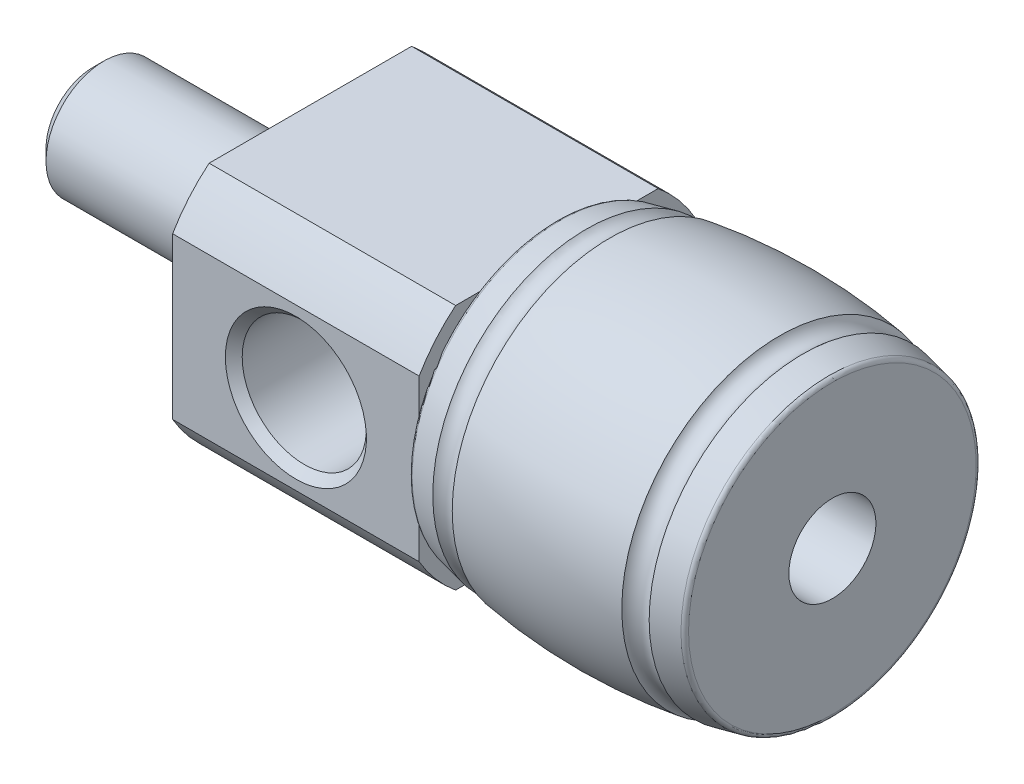
ISO-10303-21;
HEADER;
FILE_DESCRIPTION(('STEP AP214'),'2;1');
FILE_NAME('part.step','',(''),(''),'','','');
FILE_SCHEMA(('AUTOMOTIVE_DESIGN { 1 0 10303 214 1 1 1 1 }'));
ENDSEC;
DATA;
#1=APPLICATION_CONTEXT('core data for automotive mechanical design processes');
#2=APPLICATION_PROTOCOL_DEFINITION('international standard','automotive_design',2000,#1);
#3=PRODUCT_CONTEXT('',#1,'mechanical');
#4=PRODUCT('Part','Part','',(#3));
#5=PRODUCT_RELATED_PRODUCT_CATEGORY('part','',(#4));
#6=PRODUCT_DEFINITION_FORMATION('','',#4);
#7=PRODUCT_DEFINITION_CONTEXT('part definition',#1,'design');
#8=PRODUCT_DEFINITION('design','',#6,#7);
#9=PRODUCT_DEFINITION_SHAPE('','',#8);
#10=(LENGTH_UNIT() NAMED_UNIT(*) SI_UNIT(.MILLI.,.METRE.));
#11=(NAMED_UNIT(*) PLANE_ANGLE_UNIT() SI_UNIT($,.RADIAN.));
#12=(NAMED_UNIT(*) SI_UNIT($,.STERADIAN.) SOLID_ANGLE_UNIT());
#13=UNCERTAINTY_MEASURE_WITH_UNIT(LENGTH_MEASURE(1.E-05),#10,'distance_accuracy_value','');
#14=(GEOMETRIC_REPRESENTATION_CONTEXT(3) GLOBAL_UNCERTAINTY_ASSIGNED_CONTEXT((#13)) GLOBAL_UNIT_ASSIGNED_CONTEXT((#10,
#11,#12)) REPRESENTATION_CONTEXT('',''));
#15=CARTESIAN_POINT('',(0.,0.,0.));
#16=DIRECTION('',(0.,0.,1.));
#17=DIRECTION('',(1.,0.,0.));
#18=AXIS2_PLACEMENT_3D('',#15,#16,#17);
#19=CARTESIAN_POINT('',(19.,9.9192956952868,0.));
#20=DIRECTION('',(1.,0.,0.));
#21=DIRECTION('',(0.,0.,-1.));
#22=AXIS2_PLACEMENT_3D('',#19,#20,#21);
#23=PLANE('',#22);
#24=CARTESIAN_POINT('',(19.,0.,0.));
#25=DIRECTION('',(-1.,0.,0.));
#26=DIRECTION('',(0.,0.,1.));
#27=AXIS2_PLACEMENT_3D('',#24,#25,#26);
#28=CIRCLE('',#27,9.9192956952868);
#29=CARTESIAN_POINT('',(19.,0.,9.9192956952868));
#30=VERTEX_POINT('',#29);
#31=EDGE_CURVE('E233',#30,#30,#28,.T.);
#32=ORIENTED_EDGE('',*,*,#31,.F.);
#33=EDGE_LOOP('',(#32));
#34=FACE_BOUND('',#33,.T.);
#35=CARTESIAN_POINT('',(19.,0.,0.));
#36=DIRECTION('',(-1.,0.,0.));
#37=DIRECTION('',(0.,0.,1.));
#38=AXIS2_PLACEMENT_3D('',#35,#36,#37);
#39=CIRCLE('',#38,3.);
#40=CARTESIAN_POINT('',(19.,0.,3.));
#41=VERTEX_POINT('',#40);
#42=EDGE_CURVE('E133',#41,#41,#39,.T.);
#43=ORIENTED_EDGE('',*,*,#42,.T.);
#44=EDGE_LOOP('',(#43));
#45=FACE_BOUND('',#44,.T.);
#46=ADVANCED_FACE('F44',(#34,#45),#23,.T.);
#47=CARTESIAN_POINT('',(-17.,5.5452682532047,9.5));
#48=DIRECTION('',(0.,0.,1.));
#49=DIRECTION('',(1.,0.,0.));
#50=AXIS2_PLACEMENT_3D('',#47,#48,#49);
#51=PLANE('',#50);
#52=DIRECTION('',(0.,-1.,0.));
#53=VECTOR('',#52,1.);
#54=CARTESIAN_POINT('',(0.,5.5452682532047,9.5));
#55=LINE('',#54,#53);
#56=CARTESIAN_POINT('',(0.,5.5452682532047,9.5));
#57=VERTEX_POINT('',#56);
#58=CARTESIAN_POINT('',(0.,2.85349383923339,9.4999999999996));
#59=VERTEX_POINT('',#58);
#60=EDGE_CURVE('E197',#57,#59,#55,.T.);
#61=ORIENTED_EDGE('',*,*,#60,.F.);
#62=DIRECTION('',(1.,0.,0.));
#63=VECTOR('',#62,1.);
#64=CARTESIAN_POINT('',(-17.,5.5452682532047,9.5));
#65=LINE('',#64,#63);
#66=CARTESIAN_POINT('',(-17.,5.5452682532047,9.5));
#67=VERTEX_POINT('',#66);
#68=EDGE_CURVE('E188',#67,#57,#65,.T.);
#69=ORIENTED_EDGE('',*,*,#68,.F.);
#70=DIRECTION('',(0.,-1.,0.));
#71=VECTOR('',#70,1.);
#72=CARTESIAN_POINT('',(-17.,5.5452682532047,9.5));
#73=LINE('',#72,#71);
#74=CARTESIAN_POINT('',(-17.,-5.5452682532047,9.5));
#75=VERTEX_POINT('',#74);
#76=EDGE_CURVE('E176',#67,#75,#73,.T.);
#77=ORIENTED_EDGE('',*,*,#76,.T.);
#78=DIRECTION('',(1.,0.,0.));
#79=VECTOR('',#78,1.);
#80=CARTESIAN_POINT('',(-17.,-5.5452682532047,9.5));
#81=LINE('',#80,#79);
#82=CARTESIAN_POINT('',(0.,-5.5452682532047,9.5));
#83=VERTEX_POINT('',#82);
#84=EDGE_CURVE('E230',#75,#83,#81,.T.);
#85=ORIENTED_EDGE('',*,*,#84,.T.);
#86=CARTESIAN_POINT('',(0.,-2.85349383923339,9.4999999999996));
#87=VERTEX_POINT('',#86);
#88=EDGE_CURVE('E171',#87,#83,#55,.T.);
#89=ORIENTED_EDGE('',*,*,#88,.F.);
#90=EDGE_CURVE('E69',#59,#87,#55,.T.);
#91=ORIENTED_EDGE('',*,*,#90,.F.);
#92=EDGE_LOOP('',(#61,#69,#77,#85,#89,#91));
#93=FACE_BOUND('',#92,.T.);
#94=CARTESIAN_POINT('',(-8.5,0.,9.5));
#95=DIRECTION('',(0.,0.,-1.));
#96=DIRECTION('',(-1.,0.,0.));
#97=AXIS2_PLACEMENT_3D('',#94,#95,#96);
#98=CIRCLE('',#97,4.864);
#99=CARTESIAN_POINT('',(-13.364,0.,9.5));
#100=VERTEX_POINT('',#99);
#101=EDGE_CURVE('E140',#100,#100,#98,.T.);
#102=ORIENTED_EDGE('',*,*,#101,.T.);
#103=EDGE_LOOP('',(#102));
#104=FACE_BOUND('',#103,.T.);
#105=ADVANCED_FACE('F291',(#93,#104),#51,.T.);
#106=CARTESIAN_POINT('',(0.,0.,0.));
#107=DIRECTION('',(-1.,0.,0.));
#108=DIRECTION('',(0.,0.,1.));
#109=AXIS2_PLACEMENT_3D('',#106,#107,#108);
#110=PLANE('',#109);
#111=ORIENTED_EDGE('',*,*,#90,.T.);
#112=CARTESIAN_POINT('',(0.,0.,0.));
#113=DIRECTION('',(-1.,0.,0.));
#114=DIRECTION('',(0.,0.,1.));
#115=AXIS2_PLACEMENT_3D('',#112,#113,#114);
#116=CIRCLE('',#115,9.9192956952868);
#117=EDGE_CURVE('E253',#87,#59,#116,.T.);
#118=ORIENTED_EDGE('',*,*,#117,.T.);
#119=EDGE_LOOP('',(#111,#118));
#120=FACE_BOUND('',#119,.T.);
#121=ADVANCED_FACE('F328',(#120),#110,.T.);
#122=DIRECTION('',(0.,0.,-1.));
#123=VECTOR('',#122,1.);
#124=CARTESIAN_POINT('',(0.,-8.5,6.9821200218845));
#125=LINE('',#124,#123);
#126=CARTESIAN_POINT('',(0.,-8.49999999999964,5.11296656458277));
#127=VERTEX_POINT('',#126);
#128=CARTESIAN_POINT('',(0.,-8.49999999999964,-5.11296656458277));
#129=VERTEX_POINT('',#128);
#130=EDGE_CURVE('E203',#127,#129,#125,.T.);
#131=ORIENTED_EDGE('',*,*,#130,.T.);
#132=EDGE_CURVE('E263',#129,#127,#116,.T.);
#133=ORIENTED_EDGE('',*,*,#132,.T.);
#134=EDGE_LOOP('',(#131,#133));
#135=FACE_BOUND('',#134,.T.);
#136=ADVANCED_FACE('F286',(#135),#110,.T.);
#137=DIRECTION('',(0.,0.,1.));
#138=VECTOR('',#137,1.);
#139=CARTESIAN_POINT('',(0.,8.5,-6.9821200218845));
#140=LINE('',#139,#138);
#141=CARTESIAN_POINT('',(0.,8.49999999999964,-5.11296656458277));
#142=VERTEX_POINT('',#141);
#143=CARTESIAN_POINT('',(0.,8.5,5.11296656458299));
#144=VERTEX_POINT('',#143);
#145=EDGE_CURVE('E212',#142,#144,#140,.T.);
#146=ORIENTED_EDGE('',*,*,#145,.T.);
#147=EDGE_CURVE('E255',#144,#142,#116,.T.);
#148=ORIENTED_EDGE('',*,*,#147,.T.);
#149=EDGE_LOOP('',(#146,#148));
#150=FACE_BOUND('',#149,.T.);
#151=ADVANCED_FACE('F46',(#150),#110,.T.);
#152=CARTESIAN_POINT('',(0.300000000000038,0.,0.));
#153=DIRECTION('',(-1.,0.,0.));
#154=DIRECTION('',(0.,0.,1.));
#155=AXIS2_PLACEMENT_3D('',#152,#153,#154);
#156=TOROIDAL_SURFACE('',#155,9.91929569528722,0.300000000000038);
#157=CARTESIAN_POINT('',(0.230478662619469,0.,0.));
#158=DIRECTION('',(-1.,0.,0.));
#159=DIRECTION('',(0.,0.,1.));
#160=AXIS2_PLACEMENT_3D('',#157,#158,#159);
#161=CIRCLE('',#160,10.211129181455);
#162=CARTESIAN_POINT('',(0.230478662619469,0.,10.211129181455));
#163=VERTEX_POINT('',#162);
#164=EDGE_CURVE('E251',#163,#163,#161,.T.);
#165=ORIENTED_EDGE('',*,*,#164,.T.);
#166=EDGE_LOOP('',(#165));
#167=FACE_BOUND('',#166,.T.);
#168=EDGE_CURVE('E57',#59,#144,#116,.T.);
#169=ORIENTED_EDGE('',*,*,#168,.F.);
#170=ORIENTED_EDGE('',*,*,#117,.F.);
#171=EDGE_CURVE('E261',#127,#87,#116,.T.);
#172=ORIENTED_EDGE('',*,*,#171,.F.);
#173=ORIENTED_EDGE('',*,*,#132,.F.);
#174=EDGE_CURVE('E260',#142,#129,#116,.T.);
#175=ORIENTED_EDGE('',*,*,#174,.F.);
#176=ORIENTED_EDGE('',*,*,#147,.F.);
#177=EDGE_LOOP('',(#169,#170,#172,#173,#175,#176));
#178=FACE_BOUND('',#177,.T.);
#179=ADVANCED_FACE('F287',(#167,#178),#156,.T.);
#180=CARTESIAN_POINT('',(9.4999999999501,0.,0.));
#181=DIRECTION('',(-1.,0.,0.));
#182=DIRECTION('',(0.,0.,1.));
#183=AXIS2_PLACEMENT_3D('',#180,#181,#182);
#184=DEGENERATE_TOROIDAL_SURFACE('',#183,28.6999999997676,39.9999999997628,.F.);
#185=CARTESIAN_POINT('',(2.03800150985841,0.,0.));
#186=DIRECTION('',(-1.,0.,0.));
#187=DIRECTION('',(0.,0.,1.));
#188=AXIS2_PLACEMENT_3D('',#185,#186,#187);
#189=CIRCLE('',#188,10.597819004789);
#190=CARTESIAN_POINT('',(2.03800150985841,0.,10.597819004789));
#191=VERTEX_POINT('',#190);
#192=EDGE_CURVE('E248',#191,#191,#189,.T.);
#193=ORIENTED_EDGE('',*,*,#192,.T.);
#194=EDGE_LOOP('',(#193));
#195=FACE_BOUND('',#194,.T.);
#196=ORIENTED_EDGE('',*,*,#164,.F.);
#197=EDGE_LOOP('',(#196));
#198=FACE_BOUND('',#197,.T.);
#199=ADVANCED_FACE('F334',(#195,#198),#184,.F.);
#200=CARTESIAN_POINT('',(2.75000000000021,0.,0.));
#201=DIRECTION('',(-1.,0.,0.));
#202=DIRECTION('',(0.,0.,1.));
#203=AXIS2_PLACEMENT_3D('',#200,#201,#202);
#204=TOROIDAL_SURFACE('',#203,11.3000000000001,0.999999999999938);
#205=CARTESIAN_POINT('',(3.6529951098385,0.,0.));
#206=DIRECTION('',(-1.,0.,0.));
#207=DIRECTION('',(0.,0.,1.));
#208=AXIS2_PLACEMENT_3D('',#205,#206,#207);
#209=CIRCLE('',#208,10.870349174785);
#210=CARTESIAN_POINT('',(3.6529951098385,0.,10.870349174785));
#211=VERTEX_POINT('',#210);
#212=EDGE_CURVE('E245',#211,#211,#209,.T.);
#213=ORIENTED_EDGE('',*,*,#212,.T.);
#214=EDGE_LOOP('',(#213));
#215=FACE_BOUND('',#214,.T.);
#216=ORIENTED_EDGE('',*,*,#192,.F.);
#217=EDGE_LOOP('',(#216));
#218=FACE_BOUND('',#217,.T.);
#219=ADVANCED_FACE('F364',(#215,#218),#204,.F.);
#220=CARTESIAN_POINT('',(9.49999999999975,0.,0.));
#221=DIRECTION('',(-1.,0.,0.));
#222=DIRECTION('',(0.,0.,1.));
#223=AXIS2_PLACEMENT_3D('',#220,#221,#222);
#224=DEGENERATE_TOROIDAL_SURFACE('',#223,28.6999999999738,39.9999999999738,.F.);
#225=CARTESIAN_POINT('',(15.347004890161,0.,0.));
#226=DIRECTION('',(-1.,0.,0.));
#227=DIRECTION('',(0.,0.,1.));
#228=AXIS2_PLACEMENT_3D('',#225,#226,#227);
#229=CIRCLE('',#228,10.870349174785);
#230=CARTESIAN_POINT('',(15.347004890161,0.,10.870349174785));
#231=VERTEX_POINT('',#230);
#232=EDGE_CURVE('E242',#231,#231,#229,.T.);
#233=ORIENTED_EDGE('',*,*,#232,.T.);
#234=EDGE_LOOP('',(#233));
#235=FACE_BOUND('',#234,.T.);
#236=ORIENTED_EDGE('',*,*,#212,.F.);
#237=EDGE_LOOP('',(#236));
#238=FACE_BOUND('',#237,.T.);
#239=ADVANCED_FACE('F360',(#235,#238),#224,.F.);
#240=CARTESIAN_POINT('',(16.2499999999998,0.,0.));
#241=DIRECTION('',(-1.,0.,0.));
#242=DIRECTION('',(0.,0.,1.));
#243=AXIS2_PLACEMENT_3D('',#240,#241,#242);
#244=TOROIDAL_SURFACE('',#243,11.3000000000008,1.00000000000071);
#245=CARTESIAN_POINT('',(16.961998490142,0.,0.));
#246=DIRECTION('',(-1.,0.,0.));
#247=DIRECTION('',(0.,0.,1.));
#248=AXIS2_PLACEMENT_3D('',#245,#246,#247);
#249=CIRCLE('',#248,10.597819004789);
#250=CARTESIAN_POINT('',(16.961998490142,0.,10.597819004789));
#251=VERTEX_POINT('',#250);
#252=EDGE_CURVE('E239',#251,#251,#249,.T.);
#253=ORIENTED_EDGE('',*,*,#252,.T.);
#254=EDGE_LOOP('',(#253));
#255=FACE_BOUND('',#254,.T.);
#256=ORIENTED_EDGE('',*,*,#232,.F.);
#257=EDGE_LOOP('',(#256));
#258=FACE_BOUND('',#257,.T.);
#259=ADVANCED_FACE('F356',(#255,#258),#244,.F.);
#260=CARTESIAN_POINT('',(9.50000000024645,0.,0.));
#261=DIRECTION('',(-1.,0.,0.));
#262=DIRECTION('',(0.,0.,1.));
#263=AXIS2_PLACEMENT_3D('',#260,#261,#262);
#264=DEGENERATE_TOROIDAL_SURFACE('',#263,28.699999998796,39.9999999987716,.F.);
#265=CARTESIAN_POINT('',(18.769521410579,0.,0.));
#266=DIRECTION('',(-1.,0.,0.));
#267=DIRECTION('',(0.,0.,1.));
#268=AXIS2_PLACEMENT_3D('',#265,#266,#267);
#269=CIRCLE('',#268,10.211129164017);
#270=CARTESIAN_POINT('',(18.769521410579,0.,10.211129164017));
#271=VERTEX_POINT('',#270);
#272=EDGE_CURVE('E236',#271,#271,#269,.T.);
#273=ORIENTED_EDGE('',*,*,#272,.T.);
#274=EDGE_LOOP('',(#273));
#275=FACE_BOUND('',#274,.T.);
#276=ORIENTED_EDGE('',*,*,#252,.F.);
#277=EDGE_LOOP('',(#276));
#278=FACE_BOUND('',#277,.T.);
#279=ADVANCED_FACE('F352',(#275,#278),#264,.F.);
#280=CARTESIAN_POINT('',(18.7000000000013,0.,0.));
#281=DIRECTION('',(-1.,0.,0.));
#282=DIRECTION('',(0.,0.,1.));
#283=AXIS2_PLACEMENT_3D('',#280,#281,#282);
#284=TOROIDAL_SURFACE('',#283,9.91929569528786,0.299999999998655);
#285=ORIENTED_EDGE('',*,*,#31,.T.);
#286=EDGE_LOOP('',(#285));
#287=FACE_BOUND('',#286,.T.);
#288=ORIENTED_EDGE('',*,*,#272,.F.);
#289=EDGE_LOOP('',(#288));
#290=FACE_BOUND('',#289,.T.);
#291=ADVANCED_FACE('F349',(#287,#290),#284,.T.);
#292=CARTESIAN_POINT('',(0.,3.45209971719385E-13,-5.07406616723216E-13));
#293=DIRECTION('',(1.,0.,0.));
#294=DIRECTION('',(0.,1.,0.));
#295=AXIS2_PLACEMENT_3D('',#292,#293,#294);
#296=PLANE('',#295);
#297=ORIENTED_EDGE('',*,*,#171,.T.);
#298=ORIENTED_EDGE('',*,*,#88,.T.);
#299=CARTESIAN_POINT('',(0.,3.45209971719385E-13,-5.07406616723216E-13));
#300=DIRECTION('',(1.,0.,0.));
#301=DIRECTION('',(0.,1.,0.));
#302=AXIS2_PLACEMENT_3D('',#299,#300,#301);
#303=CIRCLE('',#302,11.0000000000006);
#304=CARTESIAN_POINT('',(0.,-8.5,6.9821200218845));
#305=VERTEX_POINT('',#304);
#306=EDGE_CURVE('E192',#83,#305,#303,.T.);
#307=ORIENTED_EDGE('',*,*,#306,.T.);
#308=EDGE_CURVE('E198',#305,#127,#125,.T.);
#309=ORIENTED_EDGE('',*,*,#308,.T.);
#310=EDGE_LOOP('',(#297,#298,#307,#309));
#311=FACE_BOUND('',#310,.T.);
#312=ADVANCED_FACE('F308',(#311),#296,.T.);
#313=ORIENTED_EDGE('',*,*,#174,.T.);
#314=CARTESIAN_POINT('',(0.,-8.5,-6.9821200218845));
#315=VERTEX_POINT('',#314);
#316=EDGE_CURVE('E196',#129,#315,#125,.T.);
#317=ORIENTED_EDGE('',*,*,#316,.T.);
#318=CARTESIAN_POINT('',(0.,0.,0.));
#319=DIRECTION('',(1.,0.,0.));
#320=DIRECTION('',(0.,1.,0.));
#321=AXIS2_PLACEMENT_3D('',#318,#319,#320);
#322=CIRCLE('',#321,11.0000000000001);
#323=CARTESIAN_POINT('',(0.,8.5,-6.9821200218845));
#324=VERTEX_POINT('',#323);
#325=EDGE_CURVE('E202',#315,#324,#322,.T.);
#326=ORIENTED_EDGE('',*,*,#325,.T.);
#327=EDGE_CURVE('E208',#324,#142,#140,.T.);
#328=ORIENTED_EDGE('',*,*,#327,.T.);
#329=EDGE_LOOP('',(#313,#317,#326,#328));
#330=FACE_BOUND('',#329,.T.);
#331=ADVANCED_FACE('F273',(#330),#296,.T.);
#332=ORIENTED_EDGE('',*,*,#168,.T.);
#333=CARTESIAN_POINT('',(0.,8.5,6.9821200218845));
#334=VERTEX_POINT('',#333);
#335=EDGE_CURVE('E207',#144,#334,#140,.T.);
#336=ORIENTED_EDGE('',*,*,#335,.T.);
#337=CARTESIAN_POINT('',(0.,-3.43475248243408E-13,-5.04804531509251E-13));
#338=DIRECTION('',(1.,0.,0.));
#339=DIRECTION('',(0.,1.,0.));
#340=AXIS2_PLACEMENT_3D('',#337,#338,#339);
#341=CIRCLE('',#340,11.0000000000006);
#342=EDGE_CURVE('E191',#334,#57,#341,.T.);
#343=ORIENTED_EDGE('',*,*,#342,.T.);
#344=ORIENTED_EDGE('',*,*,#60,.T.);
#345=EDGE_LOOP('',(#332,#336,#343,#344));
#346=FACE_BOUND('',#345,.T.);
#347=ADVANCED_FACE('F293',(#346),#296,.T.);
#348=CARTESIAN_POINT('',(-17.,3.45209971719385E-13,-5.07406616723216E-13));
#349=DIRECTION('',(1.,0.,0.));
#350=DIRECTION('',(0.,0.,-1.));
#351=AXIS2_PLACEMENT_3D('',#348,#349,#350);
#352=CYLINDRICAL_SURFACE('',#351,11.0000000000006);
#353=ORIENTED_EDGE('',*,*,#306,.F.);
#354=ORIENTED_EDGE('',*,*,#84,.F.);
#355=CARTESIAN_POINT('',(-17.,3.45209971719385E-13,-5.07406616723216E-13));
#356=DIRECTION('',(1.,0.,0.));
#357=DIRECTION('',(0.,1.,0.));
#358=AXIS2_PLACEMENT_3D('',#355,#356,#357);
#359=CIRCLE('',#358,11.0000000000006);
#360=CARTESIAN_POINT('',(-17.,-8.5,6.9821200218845));
#361=VERTEX_POINT('',#360);
#362=EDGE_CURVE('E172',#75,#361,#359,.T.);
#363=ORIENTED_EDGE('',*,*,#362,.T.);
#364=DIRECTION('',(1.,0.,0.));
#365=VECTOR('',#364,1.);
#366=CARTESIAN_POINT('',(-17.,-8.5,6.9821200218845));
#367=LINE('',#366,#365);
#368=EDGE_CURVE('E228',#361,#305,#367,.T.);
#369=ORIENTED_EDGE('',*,*,#368,.T.);
#370=EDGE_LOOP('',(#353,#354,#363,#369));
#371=FACE_BOUND('',#370,.T.);
#372=ADVANCED_FACE('F307',(#371),#352,.T.);
#373=CARTESIAN_POINT('',(-17.,-8.5,6.9821200218845));
#374=DIRECTION('',(0.,-1.,0.));
#375=DIRECTION('',(0.,0.,-1.));
#376=AXIS2_PLACEMENT_3D('',#373,#374,#375);
#377=PLANE('',#376);
#378=ORIENTED_EDGE('',*,*,#308,.F.);
#379=ORIENTED_EDGE('',*,*,#368,.F.);
#380=DIRECTION('',(0.,0.,-1.));
#381=VECTOR('',#380,1.);
#382=CARTESIAN_POINT('',(-17.,-8.5,6.9821200218845));
#383=LINE('',#382,#381);
#384=CARTESIAN_POINT('',(-17.,-8.5,-6.9821200218845));
#385=VERTEX_POINT('',#384);
#386=EDGE_CURVE('E175',#361,#385,#383,.T.);
#387=ORIENTED_EDGE('',*,*,#386,.T.);
#388=DIRECTION('',(1.,0.,0.));
#389=VECTOR('',#388,1.);
#390=CARTESIAN_POINT('',(-17.,-8.5,-6.9821200218845));
#391=LINE('',#390,#389);
#392=EDGE_CURVE('E225',#385,#315,#391,.T.);
#393=ORIENTED_EDGE('',*,*,#392,.T.);
#394=ORIENTED_EDGE('',*,*,#316,.F.);
#395=ORIENTED_EDGE('',*,*,#130,.F.);
#396=EDGE_LOOP('',(#378,#379,#387,#393,#394,#395));
#397=FACE_BOUND('',#396,.T.);
#398=ADVANCED_FACE('F278',(#397),#377,.T.);
#399=CARTESIAN_POINT('',(-17.,0.,0.));
#400=DIRECTION('',(1.,0.,0.));
#401=DIRECTION('',(0.,0.,-1.));
#402=AXIS2_PLACEMENT_3D('',#399,#400,#401);
#403=CYLINDRICAL_SURFACE('',#402,11.0000000000001);
#404=ORIENTED_EDGE('',*,*,#325,.F.);
#405=ORIENTED_EDGE('',*,*,#392,.F.);
#406=CARTESIAN_POINT('',(-17.,0.,0.));
#407=DIRECTION('',(1.,0.,0.));
#408=DIRECTION('',(0.,1.,0.));
#409=AXIS2_PLACEMENT_3D('',#406,#407,#408);
#410=CIRCLE('',#409,11.0000000000001);
#411=CARTESIAN_POINT('',(-17.,8.5,-6.9821200218845));
#412=VERTEX_POINT('',#411);
#413=EDGE_CURVE('E179',#385,#412,#410,.T.);
#414=ORIENTED_EDGE('',*,*,#413,.T.);
#415=DIRECTION('',(1.,0.,0.));
#416=VECTOR('',#415,1.);
#417=CARTESIAN_POINT('',(-17.,8.5,-6.9821200218845));
#418=LINE('',#417,#416);
#419=EDGE_CURVE('E223',#412,#324,#418,.T.);
#420=ORIENTED_EDGE('',*,*,#419,.T.);
#421=EDGE_LOOP('',(#404,#405,#414,#420));
#422=FACE_BOUND('',#421,.T.);
#423=ADVANCED_FACE('F314',(#422),#403,.T.);
#424=CARTESIAN_POINT('',(-17.,8.5,-6.9821200218845));
#425=DIRECTION('',(0.,1.,0.));
#426=DIRECTION('',(0.,0.,1.));
#427=AXIS2_PLACEMENT_3D('',#424,#425,#426);
#428=PLANE('',#427);
#429=ORIENTED_EDGE('',*,*,#327,.F.);
#430=ORIENTED_EDGE('',*,*,#419,.F.);
#431=DIRECTION('',(0.,0.,1.));
#432=VECTOR('',#431,1.);
#433=CARTESIAN_POINT('',(-17.,8.5,-6.9821200218845));
#434=LINE('',#433,#432);
#435=CARTESIAN_POINT('',(-17.,8.5,6.9821200218845));
#436=VERTEX_POINT('',#435);
#437=EDGE_CURVE('E182',#412,#436,#434,.T.);
#438=ORIENTED_EDGE('',*,*,#437,.T.);
#439=DIRECTION('',(1.,0.,0.));
#440=VECTOR('',#439,1.);
#441=CARTESIAN_POINT('',(-17.,8.5,6.9821200218845));
#442=LINE('',#441,#440);
#443=EDGE_CURVE('E220',#436,#334,#442,.T.);
#444=ORIENTED_EDGE('',*,*,#443,.T.);
#445=ORIENTED_EDGE('',*,*,#335,.F.);
#446=ORIENTED_EDGE('',*,*,#145,.F.);
#447=EDGE_LOOP('',(#429,#430,#438,#444,#445,#446));
#448=FACE_BOUND('',#447,.T.);
#449=ADVANCED_FACE('F317',(#448),#428,.T.);
#450=CARTESIAN_POINT('',(-17.,-3.43475248243408E-13,-5.04804531509251E-13));
#451=DIRECTION('',(1.,0.,0.));
#452=DIRECTION('',(0.,0.,-1.));
#453=AXIS2_PLACEMENT_3D('',#450,#451,#452);
#454=CYLINDRICAL_SURFACE('',#453,11.0000000000006);
#455=ORIENTED_EDGE('',*,*,#342,.F.);
#456=ORIENTED_EDGE('',*,*,#443,.F.);
#457=CARTESIAN_POINT('',(-17.,-3.43475248243408E-13,-5.04804531509251E-13));
#458=DIRECTION('',(1.,0.,0.));
#459=DIRECTION('',(0.,1.,0.));
#460=AXIS2_PLACEMENT_3D('',#457,#458,#459);
#461=CIRCLE('',#460,11.0000000000006);
#462=EDGE_CURVE('E185',#436,#67,#461,.T.);
#463=ORIENTED_EDGE('',*,*,#462,.T.);
#464=ORIENTED_EDGE('',*,*,#68,.T.);
#465=EDGE_LOOP('',(#455,#456,#463,#464));
#466=FACE_BOUND('',#465,.T.);
#467=ADVANCED_FACE('F296',(#466),#454,.T.);
#468=CARTESIAN_POINT('',(-17.,3.45209971719385E-13,-5.07406616723216E-13));
#469=DIRECTION('',(1.,0.,0.));
#470=DIRECTION('',(0.,1.,0.));
#471=AXIS2_PLACEMENT_3D('',#468,#469,#470);
#472=PLANE('',#471);
#473=CARTESIAN_POINT('',(-17.,0.,0.));
#474=DIRECTION('',(-1.,0.,0.));
#475=DIRECTION('',(0.,0.,1.));
#476=AXIS2_PLACEMENT_3D('',#473,#474,#475);
#477=CIRCLE('',#476,3.3);
#478=CARTESIAN_POINT('',(-17.,0.,3.3));
#479=VERTEX_POINT('',#478);
#480=EDGE_CURVE('E150',#479,#479,#477,.T.);
#481=ORIENTED_EDGE('',*,*,#480,.F.);
#482=EDGE_LOOP('',(#481));
#483=FACE_BOUND('',#482,.T.);
#484=ORIENTED_EDGE('',*,*,#76,.F.);
#485=ORIENTED_EDGE('',*,*,#462,.F.);
#486=ORIENTED_EDGE('',*,*,#437,.F.);
#487=ORIENTED_EDGE('',*,*,#413,.F.);
#488=ORIENTED_EDGE('',*,*,#386,.F.);
#489=ORIENTED_EDGE('',*,*,#362,.F.);
#490=EDGE_LOOP('',(#484,#485,#486,#487,#488,#489));
#491=FACE_BOUND('',#490,.T.);
#492=ADVANCED_FACE('F302',(#483,#491),#472,.F.);
#493=CARTESIAN_POINT('',(-32.,0.,0.));
#494=DIRECTION('',(-1.,0.,0.));
#495=DIRECTION('',(0.,0.,1.));
#496=AXIS2_PLACEMENT_3D('',#493,#494,#495);
#497=PLANE('',#496);
#498=CARTESIAN_POINT('',(-32.,0.,0.));
#499=DIRECTION('',(-1.,0.,0.));
#500=DIRECTION('',(0.,0.,1.));
#501=AXIS2_PLACEMENT_3D('',#498,#499,#500);
#502=CIRCLE('',#501,3.233);
#503=CARTESIAN_POINT('',(-32.,0.,3.233));
#504=VERTEX_POINT('',#503);
#505=EDGE_CURVE('E168',#504,#504,#502,.T.);
#506=ORIENTED_EDGE('',*,*,#505,.T.);
#507=EDGE_LOOP('',(#506));
#508=FACE_BOUND('',#507,.T.);
#509=ADVANCED_FACE('F524',(#508),#497,.T.);
#510=CARTESIAN_POINT('',(-32.,0.,0.));
#511=DIRECTION('',(1.,0.,0.));
#512=DIRECTION('',(0.,0.,-1.));
#513=AXIS2_PLACEMENT_3D('',#510,#511,#512);
#514=CONICAL_SURFACE('',#513,3.233,0.785398163397448);
#515=CARTESIAN_POINT('',(-31.233,0.,0.));
#516=DIRECTION('',(-1.,0.,0.));
#517=DIRECTION('',(0.,0.,1.));
#518=AXIS2_PLACEMENT_3D('',#515,#516,#517);
#519=CIRCLE('',#518,4.);
#520=CARTESIAN_POINT('',(-31.233,0.,4.));
#521=VERTEX_POINT('',#520);
#522=EDGE_CURVE('E165',#521,#521,#519,.T.);
#523=ORIENTED_EDGE('',*,*,#522,.T.);
#524=EDGE_LOOP('',(#523));
#525=FACE_BOUND('',#524,.T.);
#526=ORIENTED_EDGE('',*,*,#505,.F.);
#527=EDGE_LOOP('',(#526));
#528=FACE_BOUND('',#527,.T.);
#529=ADVANCED_FACE('F514',(#525,#528),#514,.T.);
#530=CARTESIAN_POINT('',(-17.,0.,0.));
#531=DIRECTION('',(-1.,0.,0.));
#532=DIRECTION('',(0.,0.,1.));
#533=AXIS2_PLACEMENT_3D('',#530,#531,#532);
#534=CYLINDRICAL_SURFACE('',#533,4.);
#535=CARTESIAN_POINT('',(-19.5,0.,0.));
#536=DIRECTION('',(-1.,0.,0.));
#537=DIRECTION('',(0.,0.,1.));
#538=AXIS2_PLACEMENT_3D('',#535,#536,#537);
#539=CIRCLE('',#538,4.);
#540=CARTESIAN_POINT('',(-19.5,0.,4.));
#541=VERTEX_POINT('',#540);
#542=EDGE_CURVE('E162',#541,#541,#539,.T.);
#543=ORIENTED_EDGE('',*,*,#542,.T.);
#544=EDGE_LOOP('',(#543));
#545=FACE_BOUND('',#544,.T.);
#546=ORIENTED_EDGE('',*,*,#522,.F.);
#547=EDGE_LOOP('',(#546));
#548=FACE_BOUND('',#547,.T.);
#549=ADVANCED_FACE('F504',(#545,#548),#534,.T.);
#550=CARTESIAN_POINT('',(-19.5,0.,0.));
#551=DIRECTION('',(-1.,0.,0.));
#552=DIRECTION('',(0.,0.,1.));
#553=AXIS2_PLACEMENT_3D('',#550,#551,#552);
#554=CONICAL_SURFACE('',#553,4.,0.523598775598408);
#555=CARTESIAN_POINT('',(-17.883974596216,0.,0.));
#556=DIRECTION('',(-1.,0.,0.));
#557=DIRECTION('',(0.,0.,1.));
#558=AXIS2_PLACEMENT_3D('',#555,#556,#557);
#559=CIRCLE('',#558,3.0669872981078);
#560=CARTESIAN_POINT('',(-17.883974596216,0.,3.0669872981078));
#561=VERTEX_POINT('',#560);
#562=EDGE_CURVE('E159',#561,#561,#559,.T.);
#563=ORIENTED_EDGE('',*,*,#562,.T.);
#564=EDGE_LOOP('',(#563));
#565=FACE_BOUND('',#564,.T.);
#566=ORIENTED_EDGE('',*,*,#542,.F.);
#567=EDGE_LOOP('',(#566));
#568=FACE_BOUND('',#567,.T.);
#569=ADVANCED_FACE('F494',(#565,#568),#554,.T.);
#570=CARTESIAN_POINT('',(-17.6339745962153,0.,0.));
#571=DIRECTION('',(-1.,0.,0.));
#572=DIRECTION('',(0.,0.,1.));
#573=AXIS2_PLACEMENT_3D('',#570,#571,#572);
#574=TOROIDAL_SURFACE('',#573,3.5000000000026,0.500000000002605);
#575=CARTESIAN_POINT('',(-17.633974596216,0.,0.));
#576=DIRECTION('',(-1.,0.,0.));
#577=DIRECTION('',(0.,0.,1.));
#578=AXIS2_PLACEMENT_3D('',#575,#576,#577);
#579=CIRCLE('',#578,3.);
#580=CARTESIAN_POINT('',(-17.633974596216,0.,3.));
#581=VERTEX_POINT('',#580);
#582=EDGE_CURVE('E156',#581,#581,#579,.T.);
#583=ORIENTED_EDGE('',*,*,#582,.T.);
#584=EDGE_LOOP('',(#583));
#585=FACE_BOUND('',#584,.T.);
#586=ORIENTED_EDGE('',*,*,#562,.F.);
#587=EDGE_LOOP('',(#586));
#588=FACE_BOUND('',#587,.T.);
#589=ADVANCED_FACE('F484',(#585,#588),#574,.F.);
#590=CARTESIAN_POINT('',(-17.,0.,0.));
#591=DIRECTION('',(-1.,0.,0.));
#592=DIRECTION('',(0.,0.,1.));
#593=AXIS2_PLACEMENT_3D('',#590,#591,#592);
#594=CYLINDRICAL_SURFACE('',#593,3.);
#595=CARTESIAN_POINT('',(-17.3,0.,0.));
#596=DIRECTION('',(-1.,0.,0.));
#597=DIRECTION('',(0.,0.,1.));
#598=AXIS2_PLACEMENT_3D('',#595,#596,#597);
#599=CIRCLE('',#598,3.);
#600=CARTESIAN_POINT('',(-17.3,0.,3.));
#601=VERTEX_POINT('',#600);
#602=EDGE_CURVE('E153',#601,#601,#599,.T.);
#603=ORIENTED_EDGE('',*,*,#602,.T.);
#604=EDGE_LOOP('',(#603));
#605=FACE_BOUND('',#604,.T.);
#606=ORIENTED_EDGE('',*,*,#582,.F.);
#607=EDGE_LOOP('',(#606));
#608=FACE_BOUND('',#607,.T.);
#609=ADVANCED_FACE('F475',(#605,#608),#594,.T.);
#610=CARTESIAN_POINT('',(-17.2999999999999,0.,0.));
#611=DIRECTION('',(-1.,0.,0.));
#612=DIRECTION('',(0.,0.,1.));
#613=AXIS2_PLACEMENT_3D('',#610,#611,#612);
#614=TOROIDAL_SURFACE('',#613,3.29999999999988,0.299999999999877);
#615=ORIENTED_EDGE('',*,*,#480,.T.);
#616=EDGE_LOOP('',(#615));
#617=FACE_BOUND('',#616,.T.);
#618=ORIENTED_EDGE('',*,*,#602,.F.);
#619=EDGE_LOOP('',(#618));
#620=FACE_BOUND('',#619,.T.);
#621=ADVANCED_FACE('F459',(#617,#620),#614,.F.);
#622=CARTESIAN_POINT('',(-8.5,0.,9.5));
#623=DIRECTION('',(0.,0.,1.));
#624=DIRECTION('',(1.,0.,0.));
#625=AXIS2_PLACEMENT_3D('',#622,#623,#624);
#626=CONICAL_SURFACE('',#625,4.864,0.78539816339745);
#627=CARTESIAN_POINT('',(-8.5,0.,8.919));
#628=DIRECTION('',(0.,0.,-1.));
#629=DIRECTION('',(-1.,0.,0.));
#630=AXIS2_PLACEMENT_3D('',#627,#628,#629);
#631=CIRCLE('',#630,4.283);
#632=CARTESIAN_POINT('',(-12.783,0.,8.919));
#633=VERTEX_POINT('',#632);
#634=EDGE_CURVE('E137',#633,#633,#631,.T.);
#635=ORIENTED_EDGE('',*,*,#634,.T.);
#636=EDGE_LOOP('',(#635));
#637=FACE_BOUND('',#636,.T.);
#638=ORIENTED_EDGE('',*,*,#101,.F.);
#639=EDGE_LOOP('',(#638));
#640=FACE_BOUND('',#639,.T.);
#641=ADVANCED_FACE('F451',(#637,#640),#626,.F.);
#642=CARTESIAN_POINT('',(-8.5,0.,-3.9727912029392));
#643=DIRECTION('',(0.,0.,-1.));
#644=DIRECTION('',(-1.,0.,0.));
#645=AXIS2_PLACEMENT_3D('',#642,#643,#644);
#646=CYLINDRICAL_SURFACE('',#645,4.283);
#647=CARTESIAN_POINT('',(-5.09499060206877,-2.59807621135332,-1.5));
#648=CARTESIAN_POINT('',(-5.14643897990485,-2.66555205468365,-1.38321838110718));
#649=CARTESIAN_POINT('',(-5.19566971255238,-2.72583741373303,-1.26051282851999));
#650=CARTESIAN_POINT('',(-5.28486805720291,-2.83050745682596,-1.00378229670098));
#651=CARTESIAN_POINT('',(-5.32473456783957,-2.87472118710249,-0.869653344911569));
#652=CARTESIAN_POINT('',(-5.3731552787845,-2.9270297185977,-0.661575508104667));
#653=CARTESIAN_POINT('',(-5.38743895564554,-2.94216820735549,-0.59071867572373));
#654=CARTESIAN_POINT('',(-5.41143438842445,-2.9673482031553,-0.44736407586603));
#655=CARTESIAN_POINT('',(-5.42114853340394,-2.97739237384514,-0.374867186677482));
#656=CARTESIAN_POINT('',(-5.43545962206365,-2.99212122549835,-0.2292086196028));
#657=CARTESIAN_POINT('',(-5.44008327808706,-2.99683388718879,-0.156052462729126));
#658=CARTESIAN_POINT('',(-5.44405578892052,-3.00088243350498,-0.00947376917838858));
#659=CARTESIAN_POINT('',(-5.44340543726197,-3.00021912700321,0.0639487257636207));
#660=CARTESIAN_POINT('',(-5.43447073439107,-2.99110829039129,0.262687497067341));
#661=CARTESIAN_POINT('',(-5.42106362934409,-2.97743727958967,0.387596789932112));
#662=CARTESIAN_POINT('',(-5.38075261287109,-2.93516569074894,0.632759317983157));
#663=CARTESIAN_POINT('',(-5.35381269618643,-2.9065252769988,0.752999205506553));
#664=CARTESIAN_POINT('',(-5.27921406522268,-2.82394130340411,1.02559899368388));
#665=CARTESIAN_POINT('',(-5.22764099154201,-2.76474243047206,1.17528073579735));
#666=CARTESIAN_POINT('',(-5.11477756276103,-2.62533783544851,1.46044211717049));
#667=CARTESIAN_POINT('',(-5.05347412742034,-2.54510374032478,1.59590222553891));
#668=CARTESIAN_POINT('',(-4.92623334405507,-2.36324188384552,1.85491753025794));
#669=CARTESIAN_POINT('',(-4.86021928958885,-2.2611384276111,1.97810005360652));
#670=CARTESIAN_POINT('',(-4.73072170472361,-2.03795457729084,2.207326970528));
#671=CARTESIAN_POINT('',(-4.66723650969226,-1.91688693431228,2.31338278311467));
#672=CARTESIAN_POINT('',(-4.55088677810456,-1.66344838582562,2.5013099424099));
#673=CARTESIAN_POINT('',(-4.49764725946898,-1.53196008583538,2.58413387231191));
#674=CARTESIAN_POINT('',(-4.40219248417981,-1.25439234956966,2.72964446066826));
#675=CARTESIAN_POINT('',(-4.35997321385632,-1.10831825244139,2.79233845253992));
#676=CARTESIAN_POINT('',(-4.30769651717903,-0.880270598005539,2.86908718501776));
#677=CARTESIAN_POINT('',(-4.29206836736669,-0.802397575192171,2.89185033058226));
#678=CARTESIAN_POINT('',(-4.26499625589157,-0.644391365805389,2.93110439810488));
#679=CARTESIAN_POINT('',(-4.25355015870265,-0.564259355344556,2.94759852145436));
#680=CARTESIAN_POINT('',(-4.23517264805991,-0.40244461375424,2.97401303697895));
#681=CARTESIAN_POINT('',(-4.22823896338884,-0.320762684080545,2.98393673626698));
#682=CARTESIAN_POINT('',(-4.21907402207021,-0.15662691282813,2.99704137517722));
#683=CARTESIAN_POINT('',(-4.2168421063602,-0.0741731810631902,3.00022325982215));
#684=CARTESIAN_POINT('',(-4.21729542726824,0.151136476396635,2.99958196802863));
#685=CARTESIAN_POINT('',(-4.22477284169033,0.294048891958084,2.98893056246272));
#686=CARTESIAN_POINT('',(-4.25347038143723,0.575443744119519,2.94773369976641));
#687=CARTESIAN_POINT('',(-4.27469134673982,0.71392590940874,2.91718702667721));
#688=CARTESIAN_POINT('',(-4.32876054752323,0.981461436825227,2.83830289498312));
#689=CARTESIAN_POINT('',(-4.36147153589886,1.11060529006112,2.79017517996332));
#690=CARTESIAN_POINT('',(-4.43620280503519,1.35885007366703,2.67807776007021));
#691=CARTESIAN_POINT('',(-4.47822472408565,1.47794923154094,2.61410526702087));
#692=CARTESIAN_POINT('',(-4.57500509402284,1.7197782668163,2.46278914635376));
#693=CARTESIAN_POINT('',(-4.63071406870007,1.84088624605892,2.37346921199696));
#694=CARTESIAN_POINT('',(-4.74681947339068,2.06735647965887,2.17907281419895));
#695=CARTESIAN_POINT('',(-4.80722267807584,2.17269531010203,2.07397336627916));
#696=CARTESIAN_POINT('',(-4.9391102694102,2.38373544439904,1.82982335348781));
#697=CARTESIAN_POINT('',(-5.01067826262026,2.486253342677,1.68805166261075));
#698=CARTESIAN_POINT('',(-5.14628129724781,2.66633373423226,1.38617125906181));
#699=CARTESIAN_POINT('',(-5.21032530459449,2.74392612521006,1.22608482968206));
#700=CARTESIAN_POINT('',(-5.30439192144815,2.85232534506754,0.938340207453609));
#701=CARTESIAN_POINT('',(-5.3388905178716,2.89017662723589,0.814818949133583));
#702=CARTESIAN_POINT('',(-5.39455439178614,2.94991268998535,0.561174147916887));
#703=CARTESIAN_POINT('',(-5.41574677611353,2.97182994515721,0.431064614896017));
#704=CARTESIAN_POINT('',(-5.44150479319683,2.99834578571577,0.16643198246014));
#705=CARTESIAN_POINT('',(-5.44595200611162,3.0028210310734,0.0318842116408603));
#706=CARTESIAN_POINT('',(-5.43701945343497,2.99370444790419,-0.236046385168319));
#707=CARTESIAN_POINT('',(-5.42362967579335,2.98010247249398,-0.369428514562158));
#708=CARTESIAN_POINT('',(-5.38337551133569,2.93793662457671,-0.618975783832303));
#709=CARTESIAN_POINT('',(-5.35782123438522,2.91081737378157,-0.73561472534165));
#710=CARTESIAN_POINT('',(-5.29709018809383,2.84385089895169,-0.962558728009908));
#711=CARTESIAN_POINT('',(-5.26190837003373,2.80399699497267,-1.07286042907254));
#712=CARTESIAN_POINT('',(-5.2035453853106,2.73467376508736,-1.23499545086463));
#713=CARTESIAN_POINT('',(-5.18268815169469,2.70937446567385,-1.28952718973043));
#714=CARTESIAN_POINT('',(-5.13970543799058,2.65587749781534,-1.39637516696402));
#715=CARTESIAN_POINT('',(-5.11758450504859,2.62768996321666,-1.44869829979397));
#716=CARTESIAN_POINT('',(-5.09499060206877,2.59807621135332,-1.5));
#717=B_SPLINE_CURVE_WITH_KNOTS('',3,(#647,#648,#649,#650,#651,#652,#653,#654,#655,#656,#657,
#658,#659,#660,#661,#662,#663,#664,#665,#666,#667,#668,#669,#670,#671,#672,#673,#674,#675,#676,
#677,#678,#679,#680,#681,#682,#683,#684,#685,#686,#687,#688,#689,#690,#691,#692,#693,#694,#695,
#696,#697,#698,#699,#700,#701,#702,#703,#704,#705,#706,#707,#708,#709,#710,#711,#712,#713,#714,
#715,#716),.UNSPECIFIED.,.F.,.F.,(4,2,2,2,2,2,2,2,2,2,2,2,2,2,2,2,2,2,2,2,2,2,2,2,2,2,2,2,2,2,2,
2,2,2,4),(0.,0.433827976385258,0.872144146151283,1.09339581939433,1.31453168799863,
1.53450153195279,1.75443827968321,2.13152876748291,2.50962789475133,3.01395533215434,
3.51896655520767,4.0363421835249,4.55337142123838,5.04422397519287,5.53489750616224,
5.78245323390619,6.02988237236812,6.27718687664778,6.52445671313327,6.95263465588133,
7.3808387704615,7.80409284449001,8.22742145072893,8.70702315494258,9.18733035011916,
9.75196500125074,10.3159198321603,10.7156035627597,11.1144704105472,11.5161527556376,
11.9180606633774,12.2840769127269,12.6502854714314,12.8410785520575,13.0312237482933),.UNSPECIFIED.);
#718=CARTESIAN_POINT('',(-5.09499060206877,-2.59807621135332,-1.5));
#719=VERTEX_POINT('',#718);
#720=CARTESIAN_POINT('',(-5.09499060206877,2.59807621135332,-1.5));
#721=VERTEX_POINT('',#720);
#722=EDGE_CURVE('E62',#719,#721,#717,.T.);
#723=ORIENTED_EDGE('',*,*,#722,.F.);
#724=CARTESIAN_POINT('',(-8.5,0.,-1.5));
#725=DIRECTION('',(0.,0.,-1.));
#726=DIRECTION('',(-1.,0.,0.));
#727=AXIS2_PLACEMENT_3D('',#724,#725,#726);
#728=CIRCLE('',#727,4.283);
#729=EDGE_CURVE('E132',#719,#721,#728,.T.);
#730=ORIENTED_EDGE('',*,*,#729,.T.);
#731=EDGE_LOOP('',(#723,#730));
#732=FACE_BOUND('',#731,.T.);
#733=ORIENTED_EDGE('',*,*,#634,.F.);
#734=EDGE_LOOP('',(#733));
#735=FACE_BOUND('',#734,.T.);
#736=ADVANCED_FACE('F130',(#732,#735),#646,.F.);
#737=CARTESIAN_POINT('',(-8.5,0.,-1.5));
#738=DIRECTION('',(0.,0.,1.));
#739=DIRECTION('',(1.,0.,0.));
#740=AXIS2_PLACEMENT_3D('',#737,#738,#739);
#741=CONICAL_SURFACE('',#740,4.283,1.04719755119659);
#742=CARTESIAN_POINT('',(-4.83091174920946,2.67918643621531,-1.34979999999997));
#743=CARTESIAN_POINT('',(-4.93029808043359,2.65094839083161,-1.40576516188835));
#744=CARTESIAN_POINT('',(-5.0290176587473,2.62050318171131,-1.46190728555225));
#745=CARTESIAN_POINT('',(-5.22473219101611,2.55426104641248,-1.57483696392554));
#746=CARTESIAN_POINT('',(-5.32172033888785,2.51844670498277,-1.63162604175127));
#747=CARTESIAN_POINT('',(-5.51527853170864,2.43974293023354,-1.74718410553755));
#748=CARTESIAN_POINT('',(-5.61177879273089,2.39670030194598,-1.80596730345001));
#749=CARTESIAN_POINT('',(-5.80038875853483,2.30288286219568,-1.92416916363517));
#750=CARTESIAN_POINT('',(-5.89250448831609,2.25211908859299,-1.98358680794226));
#751=CARTESIAN_POINT('',(-6.06793889727558,2.14236408929826,-2.10157190897448));
#752=CARTESIAN_POINT('',(-6.15142611465859,2.08362683197314,-2.16012010810404));
#753=CARTESIAN_POINT('',(-6.30853570201755,1.95481865726558,-2.27732940857506));
#754=CARTESIAN_POINT('',(-6.38220352493435,1.88480352786397,-2.3359886171568));
#755=CARTESIAN_POINT('',(-6.5034186725603,1.74415703333576,-2.44218377356179));
#756=CARTESIAN_POINT('',(-6.55327926113657,1.67570069517416,-2.48989838859589));
#757=CARTESIAN_POINT('',(-6.63948306990028,1.5291654788134,-2.58246132265764));
#758=CARTESIAN_POINT('',(-6.67585926076044,1.45111070110332,-2.62731640792627));
#759=CARTESIAN_POINT('',(-6.73400089499283,1.28714083873599,-2.71140802300603));
#760=CARTESIAN_POINT('',(-6.75578308766669,1.20123489391941,-2.75065095295557));
#761=CARTESIAN_POINT('',(-6.78754868640384,1.02400811974762,-2.82144863843229));
#762=CARTESIAN_POINT('',(-6.79748561211578,0.932667425950151,-2.85297272383761));
#763=CARTESIAN_POINT('',(-6.8090758358777,0.763494703572854,-2.9023134429069));
#764=CARTESIAN_POINT('',(-6.81188501085016,0.686137165206421,-2.92156920493513));
#765=CARTESIAN_POINT('',(-6.81509579366933,0.530049219603833,-2.95387892064186));
#766=CARTESIAN_POINT('',(-6.81549595360703,0.451318015243514,-2.96692914021649));
#767=CARTESIAN_POINT('',(-6.8156270842146,0.292945411276285,-2.98673124429765));
#768=CARTESIAN_POINT('',(-6.81535698478265,0.21330275850515,-2.99347303342989));
#769=CARTESIAN_POINT('',(-6.81506253889963,0.0537590912040921,-3.00058051734203));
#770=CARTESIAN_POINT('',(-6.81503810968809,-0.0261418272480756,-3.00094835938347));
#771=CARTESIAN_POINT('',(-6.81529091151038,-0.188050971741721,-2.99522766147385));
#772=CARTESIAN_POINT('',(-6.81557697805768,-0.270052552024793,-2.98895014891302));
#773=CARTESIAN_POINT('',(-6.81556400589814,-0.433313253407205,-2.96968027655066));
#774=CARTESIAN_POINT('',(-6.81526462306191,-0.514571909605323,-2.95668397071996));
#775=CARTESIAN_POINT('',(-6.81223144941382,-0.675427248987244,-2.92412397868144));
#776=CARTESIAN_POINT('',(-6.80950674256729,-0.755029000552107,-2.90458496813712));
#777=CARTESIAN_POINT('',(-6.79903817594509,-0.912006052051997,-2.85918065339495));
#778=CARTESIAN_POINT('',(-6.79130057206547,-0.989384001675535,-2.83332325930481));
#779=CARTESIAN_POINT('',(-6.76547571701202,-1.15620286470598,-2.76995356920054));
#780=CARTESIAN_POINT('',(-6.74560911322548,-1.24491130586207,-2.73114133311204));
#781=CARTESIAN_POINT('',(-6.69098064639749,-1.41431658658823,-2.64738142006239));
#782=CARTESIAN_POINT('',(-6.65625449307626,-1.49503206543873,-2.6024486270582));
#783=CARTESIAN_POINT('',(-6.57276151004668,-1.64626861210253,-2.5095206468171));
#784=CARTESIAN_POINT('',(-6.52404076166361,-1.71682201499563,-2.46153590632403));
#785=CARTESIAN_POINT('',(-6.41566183661609,-1.84830119194481,-2.3644247987247));
#786=CARTESIAN_POINT('',(-6.35596821325542,-1.90919453701075,-2.31529519584304));
#787=CARTESIAN_POINT('',(-6.2327004524305,-2.01913066753678,-2.21993136167939));
#788=CARTESIAN_POINT('',(-6.16954704593398,-2.06865363949986,-2.17369314265738));
#789=CARTESIAN_POINT('',(-6.03847284607073,-2.1613594080935,-2.08153771209492));
#790=CARTESIAN_POINT('',(-5.9705474598966,-2.20453596954375,-2.03562085790286));
#791=CARTESIAN_POINT('',(-5.8311189361832,-2.28567372744061,-1.94407974650803));
#792=CARTESIAN_POINT('',(-5.75960508986272,-2.32361787025466,-1.89845688751871));
#793=CARTESIAN_POINT('',(-5.61408926840114,-2.39496564128027,-1.80761510970067));
#794=CARTESIAN_POINT('',(-5.54008653544512,-2.42836787067154,-1.76239631930513));
#795=CARTESIAN_POINT('',(-5.36173335111835,-2.503219527507,-1.65518861797701));
#796=CARTESIAN_POINT('',(-5.25654346436395,-2.54289912115041,-1.59336120915013));
#797=CARTESIAN_POINT('',(-5.09747475105518,-2.59753629460463,-1.50135087318791));
#798=CARTESIAN_POINT('',(-5.04450789047592,-2.61485976192184,-1.47095389656604));
#799=CARTESIAN_POINT('',(-4.93807107815103,-2.64807166151173,-1.41028764749657));
#800=CARTESIAN_POINT('',(-4.88460124956421,-2.66396043548338,-1.38001834628657));
#801=CARTESIAN_POINT('',(-4.83091174920946,-2.67918643621531,-1.34979999999997));
#802=B_SPLINE_CURVE_WITH_KNOTS('',3,(#742,#743,#744,#745,#746,#747,#748,#749,#750,#751,#752,
#753,#754,#755,#756,#757,#758,#759,#760,#761,#762,#763,#764,#765,#766,#767,#768,#769,#770,#771,
#772,#773,#774,#775,#776,#777,#778,#779,#780,#781,#782,#783,#784,#785,#786,#787,#788,#789,#790,
#791,#792,#793,#794,#795,#796,#797,#798,#799,#800,#801),.UNSPECIFIED.,.F.,.F.,(4,2,2,2,2,2,2,2,
2,2,2,2,2,2,2,2,2,2,2,2,2,2,2,2,2,2,2,2,2,4),(0.,0.352563962689025,0.706297282741133,
1.06878716810302,1.43076363921419,1.7831380531068,2.13382008930711,2.42421737955686,
2.71389986180307,3.00324930791101,3.2937304509096,3.53273614066053,3.7718854675265,
4.01141685354001,4.25086754441625,4.49731509764017,4.74390755722741,4.98958028176276,
5.23494700555624,5.53002902870603,5.82440587332877,6.11782429436804,6.41220778330585,
6.6896576646819,6.96737833691783,7.24598378734728,7.5246748493825,7.90934060325371,
8.09976415433465,8.29014223220647),.UNSPECIFIED.);
#803=EDGE_CURVE('E11',#721,#719,#802,.T.);
#804=ORIENTED_EDGE('',*,*,#803,.F.);
#805=ORIENTED_EDGE('',*,*,#729,.F.);
#806=EDGE_LOOP('',(#804,#805));
#807=FACE_BOUND('',#806,.T.);
#808=CARTESIAN_POINT('',(-8.5,0.,-3.9727912029392));
#809=VERTEX_POINT('',#808);
#810=VERTEX_LOOP('',#809);
#811=FACE_BOUND('',#810,.T.);
#812=ADVANCED_FACE('F135',(#807,#811),#741,.F.);
#813=CARTESIAN_POINT('',(19.,0.,0.));
#814=DIRECTION('',(-1.,0.,0.));
#815=DIRECTION('',(0.,0.,1.));
#816=AXIS2_PLACEMENT_3D('',#813,#814,#815);
#817=CYLINDRICAL_SURFACE('',#816,3.);
#818=ORIENTED_EDGE('',*,*,#42,.F.);
#819=EDGE_LOOP('',(#818));
#820=FACE_BOUND('',#819,.T.);
#821=ORIENTED_EDGE('',*,*,#722,.T.);
#822=ORIENTED_EDGE('',*,*,#803,.T.);
#823=EDGE_LOOP('',(#821,#822));
#824=FACE_BOUND('',#823,.T.);
#825=ADVANCED_FACE('F125',(#820,#824),#817,.F.);
#826=CLOSED_SHELL('',(#46,#105,#121,#136,#151,#179,#199,#219,#239,#259,#279,#291,#312,#331,#347,
#372,#398,#423,#449,#467,#492,#509,#529,#549,#569,#589,#609,#621,#641,#736,#812,#825));
#827=MANIFOLD_SOLID_BREP('B2',#826);
#828=ADVANCED_BREP_SHAPE_REPRESENTATION('',(#18,#827),#14);
#829=SHAPE_DEFINITION_REPRESENTATION(#9,#828);
ENDSEC;
END-ISO-10303-21;
